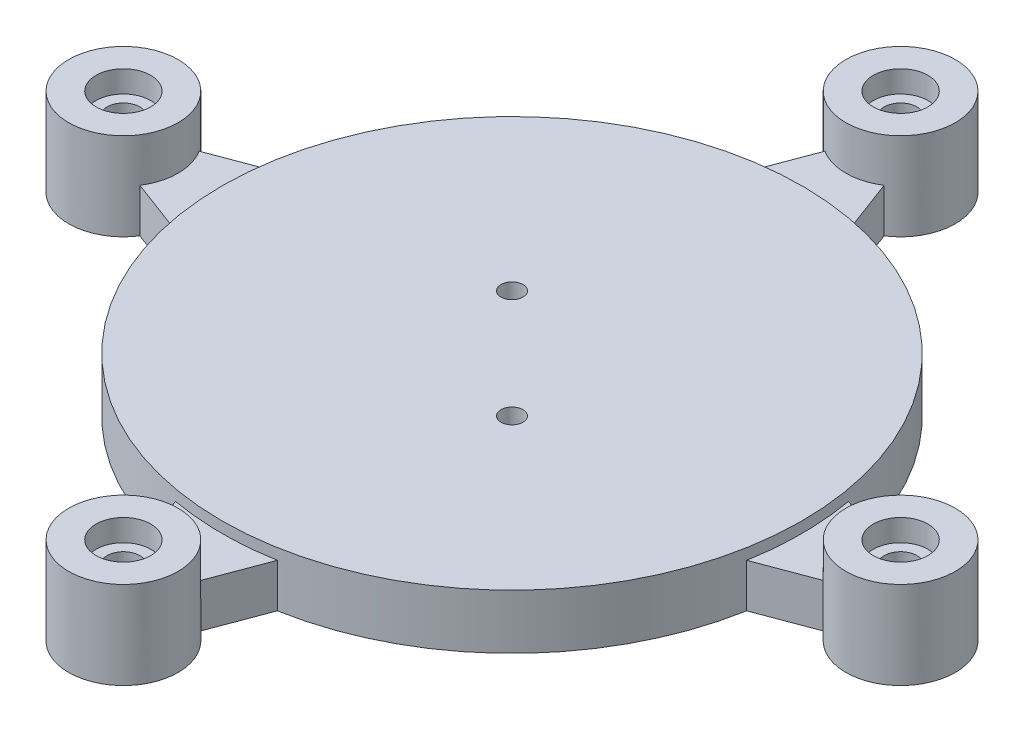
ISO-10303-21;
HEADER;
FILE_DESCRIPTION(('STEP AP214'),'2;1');
FILE_NAME('part.step','',(''),(''),'','','');
FILE_SCHEMA(('AUTOMOTIVE_DESIGN { 1 0 10303 214 1 1 1 1 }'));
ENDSEC;
DATA;
#1=APPLICATION_CONTEXT('core data for automotive mechanical design processes');
#2=APPLICATION_PROTOCOL_DEFINITION('international standard','automotive_design',2000,#1);
#3=PRODUCT_CONTEXT('',#1,'mechanical');
#4=PRODUCT('Part','Part','',(#3));
#5=PRODUCT_RELATED_PRODUCT_CATEGORY('part','',(#4));
#6=PRODUCT_DEFINITION_FORMATION('','',#4);
#7=PRODUCT_DEFINITION_CONTEXT('part definition',#1,'design');
#8=PRODUCT_DEFINITION('design','',#6,#7);
#9=PRODUCT_DEFINITION_SHAPE('','',#8);
#10=(LENGTH_UNIT() NAMED_UNIT(*) SI_UNIT(.MILLI.,.METRE.));
#11=(NAMED_UNIT(*) PLANE_ANGLE_UNIT() SI_UNIT($,.RADIAN.));
#12=(NAMED_UNIT(*) SI_UNIT($,.STERADIAN.) SOLID_ANGLE_UNIT());
#13=UNCERTAINTY_MEASURE_WITH_UNIT(LENGTH_MEASURE(1.E-05),#10,'distance_accuracy_value','');
#14=(GEOMETRIC_REPRESENTATION_CONTEXT(3) GLOBAL_UNCERTAINTY_ASSIGNED_CONTEXT((#13)) GLOBAL_UNIT_ASSIGNED_CONTEXT((#10,
#11,#12)) REPRESENTATION_CONTEXT('',''));
#15=CARTESIAN_POINT('',(0.,0.,0.));
#16=DIRECTION('',(0.,0.,1.));
#17=DIRECTION('',(1.,0.,0.));
#18=AXIS2_PLACEMENT_3D('',#15,#16,#17);
#19=CARTESIAN_POINT('',(35.5,4.,-3.71842762586794E-13));
#20=DIRECTION('',(0.,1.,0.));
#21=DIRECTION('',(-1.,0.,0.));
#22=AXIS2_PLACEMENT_3D('',#19,#20,#21);
#23=PLANE('',#22);
#24=DIRECTION('',(0.936329177569041,0.,-0.351123441588401));
#25=VECTOR('',#24,1.);
#26=CARTESIAN_POINT('',(25.0889608554065,4.,5.02913967922232));
#27=LINE('',#26,#25);
#28=CARTESIAN_POINT('',(26.0880387335617,4.,4.65448547491412));
#29=VERTEX_POINT('',#28);
#30=CARTESIAN_POINT('',(31.2932902974639,4.,2.70251613845072));
#31=VERTEX_POINT('',#30);
#32=EDGE_CURVE('E152',#29,#31,#27,.T.);
#33=ORIENTED_EDGE('',*,*,#32,.T.);
#34=CARTESIAN_POINT('',(35.5,4.,-3.71842762586794E-13));
#35=DIRECTION('',(0.,1.,0.));
#36=DIRECTION('',(-1.,0.,0.));
#37=AXIS2_PLACEMENT_3D('',#34,#35,#36);
#38=CIRCLE('',#37,5.);
#39=CARTESIAN_POINT('',(31.2932902974638,4.,-2.70251613845138));
#40=VERTEX_POINT('',#39);
#41=EDGE_CURVE('E159',#40,#31,#38,.T.);
#42=ORIENTED_EDGE('',*,*,#41,.F.);
#43=DIRECTION('',(-0.936329177569048,0.,-0.351123441588382));
#44=VECTOR('',#43,1.);
#45=CARTESIAN_POINT('',(25.0889608554064,4.,-5.02913967922285));
#46=LINE('',#45,#44);
#47=CARTESIAN_POINT('',(26.0880387335616,4.,-4.65448547491467));
#48=VERTEX_POINT('',#47);
#49=EDGE_CURVE('E143',#40,#48,#46,.T.);
#50=ORIENTED_EDGE('',*,*,#49,.T.);
#51=CARTESIAN_POINT('',(0.,4.,0.));
#52=DIRECTION('',(0.,1.,0.));
#53=DIRECTION('',(0.,0.,1.));
#54=AXIS2_PLACEMENT_3D('',#51,#52,#53);
#55=CIRCLE('',#54,26.5);
#56=EDGE_CURVE('E11',#29,#48,#55,.T.);
#57=ORIENTED_EDGE('',*,*,#56,.F.);
#58=EDGE_LOOP('',(#33,#42,#50,#57));
#59=FACE_BOUND('',#58,.T.);
#60=ADVANCED_FACE('F33',(#59),#23,.T.);
#61=CARTESIAN_POINT('',(0.,4.,35.5));
#62=DIRECTION('',(0.,1.,0.));
#63=DIRECTION('',(0.,0.,-1.));
#64=AXIS2_PLACEMENT_3D('',#61,#62,#63);
#65=PLANE('',#64);
#66=DIRECTION('',(0.351123441588391,0.,0.936329177569045));
#67=VECTOR('',#66,1.);
#68=CARTESIAN_POINT('',(-5.02913967922259,4.,25.0889608554064));
#69=LINE('',#68,#67);
#70=CARTESIAN_POINT('',(-4.6544854749144,4.,26.0880387335616));
#71=VERTEX_POINT('',#70);
#72=CARTESIAN_POINT('',(-2.70251613845105,4.,31.2932902974639));
#73=VERTEX_POINT('',#72);
#74=EDGE_CURVE('E198',#71,#73,#69,.T.);
#75=ORIENTED_EDGE('',*,*,#74,.T.);
#76=CARTESIAN_POINT('',(0.,4.,35.5));
#77=DIRECTION('',(0.,1.,0.));
#78=DIRECTION('',(0.,0.,-1.));
#79=AXIS2_PLACEMENT_3D('',#76,#77,#78);
#80=CIRCLE('',#79,5.);
#81=CARTESIAN_POINT('',(2.70251613845105,4.,31.2932902974639));
#82=VERTEX_POINT('',#81);
#83=EDGE_CURVE('E170',#82,#73,#80,.T.);
#84=ORIENTED_EDGE('',*,*,#83,.F.);
#85=DIRECTION('',(0.351123441588391,0.,-0.936329177569045));
#86=VECTOR('',#85,1.);
#87=CARTESIAN_POINT('',(5.02913967922259,4.,25.0889608554064));
#88=LINE('',#87,#86);
#89=CARTESIAN_POINT('',(4.6544854749144,4.,26.0880387335616));
#90=VERTEX_POINT('',#89);
#91=EDGE_CURVE('E200',#82,#90,#88,.T.);
#92=ORIENTED_EDGE('',*,*,#91,.T.);
#93=CARTESIAN_POINT('',(0.,4.,0.));
#94=DIRECTION('',(0.,1.,0.));
#95=DIRECTION('',(0.,0.,1.));
#96=AXIS2_PLACEMENT_3D('',#93,#94,#95);
#97=CIRCLE('',#96,26.5);
#98=EDGE_CURVE('E41',#71,#90,#97,.T.);
#99=ORIENTED_EDGE('',*,*,#98,.F.);
#100=EDGE_LOOP('',(#75,#84,#92,#99));
#101=FACE_BOUND('',#100,.T.);
#102=ADVANCED_FACE('F306',(#101),#65,.T.);
#103=CARTESIAN_POINT('',(-35.5,4.,1.23947587528931E-13));
#104=DIRECTION('',(0.,1.,0.));
#105=DIRECTION('',(1.,0.,0.));
#106=AXIS2_PLACEMENT_3D('',#103,#104,#105);
#107=PLANE('',#106);
#108=DIRECTION('',(-0.936329177569043,0.,0.351123441588395));
#109=VECTOR('',#108,1.);
#110=CARTESIAN_POINT('',(-25.0889608554065,4.,-5.0291396792225));
#111=LINE('',#110,#109);
#112=CARTESIAN_POINT('',(-26.0880387335616,4.,-4.65448547491431));
#113=VERTEX_POINT('',#112);
#114=CARTESIAN_POINT('',(-31.2932902974639,4.,-2.70251613845094));
#115=VERTEX_POINT('',#114);
#116=EDGE_CURVE('E222',#113,#115,#111,.T.);
#117=ORIENTED_EDGE('',*,*,#116,.T.);
#118=CARTESIAN_POINT('',(-35.5,4.,1.23947587528931E-13));
#119=DIRECTION('',(0.,1.,0.));
#120=DIRECTION('',(1.,0.,0.));
#121=AXIS2_PLACEMENT_3D('',#118,#119,#120);
#122=CIRCLE('',#121,5.);
#123=CARTESIAN_POINT('',(-31.2932902974639,4.,2.70251613845116));
#124=VERTEX_POINT('',#123);
#125=EDGE_CURVE('E180',#124,#115,#122,.T.);
#126=ORIENTED_EDGE('',*,*,#125,.F.);
#127=DIRECTION('',(0.936329177569046,0.,0.351123441588388));
#128=VECTOR('',#127,1.);
#129=CARTESIAN_POINT('',(-25.0889608554064,4.,5.02913967922268));
#130=LINE('',#129,#128);
#131=CARTESIAN_POINT('',(-26.0880387335616,4.,4.65448547491449));
#132=VERTEX_POINT('',#131);
#133=EDGE_CURVE('E224',#124,#132,#130,.T.);
#134=ORIENTED_EDGE('',*,*,#133,.T.);
#135=CARTESIAN_POINT('',(0.,4.,0.));
#136=DIRECTION('',(0.,1.,0.));
#137=DIRECTION('',(0.,0.,1.));
#138=AXIS2_PLACEMENT_3D('',#135,#136,#137);
#139=CIRCLE('',#138,26.5);
#140=EDGE_CURVE('E296',#113,#132,#139,.T.);
#141=ORIENTED_EDGE('',*,*,#140,.F.);
#142=EDGE_LOOP('',(#117,#126,#134,#141));
#143=FACE_BOUND('',#142,.T.);
#144=ADVANCED_FACE('F353',(#143),#107,.T.);
#145=CARTESIAN_POINT('',(0.,5.,0.));
#146=DIRECTION('',(0.,-1.,0.));
#147=DIRECTION('',(0.,0.,-1.));
#148=AXIS2_PLACEMENT_3D('',#145,#146,#147);
#149=CYLINDRICAL_SURFACE('',#148,26.5);
#150=CARTESIAN_POINT('',(0.,5.,0.));
#151=DIRECTION('',(0.,1.,0.));
#152=DIRECTION('',(0.,0.,1.));
#153=AXIS2_PLACEMENT_3D('',#150,#151,#152);
#154=CIRCLE('',#153,26.5);
#155=CARTESIAN_POINT('',(0.,5.,26.5));
#156=VERTEX_POINT('',#155);
#157=EDGE_CURVE('E288',#156,#156,#154,.T.);
#158=ORIENTED_EDGE('',*,*,#157,.F.);
#159=EDGE_LOOP('',(#158));
#160=FACE_BOUND('',#159,.T.);
#161=DIRECTION('',(0.,-1.,0.));
#162=VECTOR('',#161,1.);
#163=CARTESIAN_POINT('',(26.0880387335617,5.,4.65448547491412));
#164=LINE('',#163,#162);
#165=CARTESIAN_POINT('',(26.0880387335617,0.,4.65448547491413));
#166=VERTEX_POINT('',#165);
#167=EDGE_CURVE('E51',#29,#166,#164,.T.);
#168=ORIENTED_EDGE('',*,*,#167,.F.);
#169=ORIENTED_EDGE('',*,*,#56,.T.);
#170=DIRECTION('',(0.,-1.,0.));
#171=VECTOR('',#170,1.);
#172=CARTESIAN_POINT('',(26.0880387335616,5.,-4.65448547491467));
#173=LINE('',#172,#171);
#174=CARTESIAN_POINT('',(26.0880387335616,0.,-4.65448547491467));
#175=VERTEX_POINT('',#174);
#176=EDGE_CURVE('E149',#175,#48,#173,.F.);
#177=ORIENTED_EDGE('',*,*,#176,.F.);
#178=CARTESIAN_POINT('',(0.,0.,0.));
#179=DIRECTION('',(0.,1.,0.));
#180=DIRECTION('',(0.,0.,1.));
#181=AXIS2_PLACEMENT_3D('',#178,#179,#180);
#182=CIRCLE('',#181,26.5);
#183=CARTESIAN_POINT('',(4.65448547491439,0.,-26.0880387335616));
#184=VERTEX_POINT('',#183);
#185=EDGE_CURVE('E287',#175,#184,#182,.T.);
#186=ORIENTED_EDGE('',*,*,#185,.T.);
#187=DIRECTION('',(0.,-1.,0.));
#188=VECTOR('',#187,1.);
#189=CARTESIAN_POINT('',(4.6544854749144,5.,-26.0880387335616));
#190=LINE('',#189,#188);
#191=CARTESIAN_POINT('',(4.6544854749144,4.,-26.0880387335616));
#192=VERTEX_POINT('',#191);
#193=EDGE_CURVE('E284',#192,#184,#190,.T.);
#194=ORIENTED_EDGE('',*,*,#193,.F.);
#195=CARTESIAN_POINT('',(0.,4.,0.));
#196=DIRECTION('',(0.,1.,0.));
#197=DIRECTION('',(0.,0.,1.));
#198=AXIS2_PLACEMENT_3D('',#195,#196,#197);
#199=CIRCLE('',#198,26.5);
#200=CARTESIAN_POINT('',(-4.6544854749144,4.,-26.0880387335616));
#201=VERTEX_POINT('',#200);
#202=EDGE_CURVE('E291',#192,#201,#199,.T.);
#203=ORIENTED_EDGE('',*,*,#202,.T.);
#204=DIRECTION('',(0.,-1.,0.));
#205=VECTOR('',#204,1.);
#206=CARTESIAN_POINT('',(-4.6544854749144,5.,-26.0880387335616));
#207=LINE('',#206,#205);
#208=CARTESIAN_POINT('',(-4.6544854749144,0.,-26.0880387335616));
#209=VERTEX_POINT('',#208);
#210=EDGE_CURVE('E281',#209,#201,#207,.F.);
#211=ORIENTED_EDGE('',*,*,#210,.F.);
#212=CARTESIAN_POINT('',(-26.0880387335616,0.,-4.65448547491431));
#213=VERTEX_POINT('',#212);
#214=EDGE_CURVE('E292',#209,#213,#182,.T.);
#215=ORIENTED_EDGE('',*,*,#214,.T.);
#216=DIRECTION('',(0.,-1.,0.));
#217=VECTOR('',#216,1.);
#218=CARTESIAN_POINT('',(-26.0880387335616,5.,-4.65448547491431));
#219=LINE('',#218,#217);
#220=EDGE_CURVE('E242',#113,#213,#219,.T.);
#221=ORIENTED_EDGE('',*,*,#220,.F.);
#222=ORIENTED_EDGE('',*,*,#140,.T.);
#223=DIRECTION('',(0.,-1.,0.));
#224=VECTOR('',#223,1.);
#225=CARTESIAN_POINT('',(-26.0880387335616,5.,4.65448547491449));
#226=LINE('',#225,#224);
#227=CARTESIAN_POINT('',(-26.0880387335616,0.,4.65448547491449));
#228=VERTEX_POINT('',#227);
#229=EDGE_CURVE('E239',#228,#132,#226,.F.);
#230=ORIENTED_EDGE('',*,*,#229,.F.);
#231=CARTESIAN_POINT('',(-4.65448547491439,0.,26.0880387335616));
#232=VERTEX_POINT('',#231);
#233=EDGE_CURVE('E294',#228,#232,#182,.T.);
#234=ORIENTED_EDGE('',*,*,#233,.T.);
#235=DIRECTION('',(0.,-1.,0.));
#236=VECTOR('',#235,1.);
#237=CARTESIAN_POINT('',(-4.6544854749144,5.,26.0880387335616));
#238=LINE('',#237,#236);
#239=EDGE_CURVE('E218',#71,#232,#238,.T.);
#240=ORIENTED_EDGE('',*,*,#239,.F.);
#241=ORIENTED_EDGE('',*,*,#98,.T.);
#242=DIRECTION('',(0.,-1.,0.));
#243=VECTOR('',#242,1.);
#244=CARTESIAN_POINT('',(4.6544854749144,5.,26.0880387335616));
#245=LINE('',#244,#243);
#246=CARTESIAN_POINT('',(4.6544854749144,0.,26.0880387335616));
#247=VERTEX_POINT('',#246);
#248=EDGE_CURVE('E215',#247,#90,#245,.F.);
#249=ORIENTED_EDGE('',*,*,#248,.F.);
#250=EDGE_CURVE('E317',#247,#166,#182,.T.);
#251=ORIENTED_EDGE('',*,*,#250,.T.);
#252=EDGE_LOOP('',(#168,#169,#177,#186,#194,#203,#211,#215,#221,#222,#230,#234,#240,#241,#249,#251));
#253=FACE_BOUND('',#252,.T.);
#254=ADVANCED_FACE('F35',(#160,#253),#149,.T.);
#255=CARTESIAN_POINT('',(0.,4.,-35.5));
#256=DIRECTION('',(0.,1.,0.));
#257=DIRECTION('',(0.,0.,1.));
#258=AXIS2_PLACEMENT_3D('',#255,#256,#257);
#259=PLANE('',#258);
#260=DIRECTION('',(-0.351123441588391,0.,-0.936329177569045));
#261=VECTOR('',#260,1.);
#262=CARTESIAN_POINT('',(5.02913967922259,4.,-25.0889608554064));
#263=LINE('',#262,#261);
#264=CARTESIAN_POINT('',(2.70251613845105,4.,-31.2932902974639));
#265=VERTEX_POINT('',#264);
#266=EDGE_CURVE('E264',#192,#265,#263,.T.);
#267=ORIENTED_EDGE('',*,*,#266,.T.);
#268=CARTESIAN_POINT('',(0.,4.,-35.5));
#269=DIRECTION('',(0.,1.,0.));
#270=DIRECTION('',(0.,0.,1.));
#271=AXIS2_PLACEMENT_3D('',#268,#269,#270);
#272=CIRCLE('',#271,5.);
#273=CARTESIAN_POINT('',(-2.70251613845105,4.,-31.2932902974639));
#274=VERTEX_POINT('',#273);
#275=EDGE_CURVE('E255',#274,#265,#272,.T.);
#276=ORIENTED_EDGE('',*,*,#275,.F.);
#277=DIRECTION('',(-0.351123441588391,0.,0.936329177569045));
#278=VECTOR('',#277,1.);
#279=CARTESIAN_POINT('',(-5.02913967922259,4.,-25.0889608554064));
#280=LINE('',#279,#278);
#281=EDGE_CURVE('E266',#274,#201,#280,.T.);
#282=ORIENTED_EDGE('',*,*,#281,.T.);
#283=ORIENTED_EDGE('',*,*,#202,.F.);
#284=EDGE_LOOP('',(#267,#276,#282,#283));
#285=FACE_BOUND('',#284,.T.);
#286=ADVANCED_FACE('F335',(#285),#259,.T.);
#287=CARTESIAN_POINT('',(0.,5.,0.));
#288=DIRECTION('',(0.,1.,0.));
#289=DIRECTION('',(0.,0.,1.));
#290=AXIS2_PLACEMENT_3D('',#287,#288,#289);
#291=PLANE('',#290);
#292=CARTESIAN_POINT('',(4.94974746830583,5.,4.94974746830584));
#293=DIRECTION('',(0.,1.,0.));
#294=DIRECTION('',(0.,0.,1.));
#295=AXIS2_PLACEMENT_3D('',#292,#293,#294);
#296=CIRCLE('',#295,1.);
#297=CARTESIAN_POINT('',(4.94974746830583,5.,5.94974746830584));
#298=VERTEX_POINT('',#297);
#299=EDGE_CURVE('E700',#298,#298,#296,.T.);
#300=ORIENTED_EDGE('',*,*,#299,.F.);
#301=EDGE_LOOP('',(#300));
#302=FACE_BOUND('',#301,.T.);
#303=CARTESIAN_POINT('',(-4.94974746830583,5.,-4.94974746830584));
#304=DIRECTION('',(0.,1.,0.));
#305=DIRECTION('',(0.,0.,1.));
#306=AXIS2_PLACEMENT_3D('',#303,#304,#305);
#307=CIRCLE('',#306,1.);
#308=CARTESIAN_POINT('',(-4.94974746830583,5.,-3.94974746830584));
#309=VERTEX_POINT('',#308);
#310=EDGE_CURVE('E696',#309,#309,#307,.T.);
#311=ORIENTED_EDGE('',*,*,#310,.F.);
#312=EDGE_LOOP('',(#311));
#313=FACE_BOUND('',#312,.T.);
#314=ORIENTED_EDGE('',*,*,#157,.T.);
#315=EDGE_LOOP('',(#314));
#316=FACE_BOUND('',#315,.T.);
#317=ADVANCED_FACE('F624',(#302,#313,#316),#291,.T.);
#318=CARTESIAN_POINT('',(0.,0.,0.));
#319=DIRECTION('',(0.,1.,0.));
#320=DIRECTION('',(0.,0.,1.));
#321=AXIS2_PLACEMENT_3D('',#318,#319,#320);
#322=PLANE('',#321);
#323=CARTESIAN_POINT('',(4.94974746830583,0.,4.94974746830584));
#324=DIRECTION('',(0.,1.,0.));
#325=DIRECTION('',(0.,0.,1.));
#326=AXIS2_PLACEMENT_3D('',#323,#324,#325);
#327=CIRCLE('',#326,1.);
#328=CARTESIAN_POINT('',(4.94974746830583,0.,5.94974746830584));
#329=VERTEX_POINT('',#328);
#330=EDGE_CURVE('E638',#329,#329,#327,.T.);
#331=ORIENTED_EDGE('',*,*,#330,.T.);
#332=EDGE_LOOP('',(#331));
#333=FACE_BOUND('',#332,.T.);
#334=CARTESIAN_POINT('',(-4.94974746830583,0.,-4.94974746830584));
#335=DIRECTION('',(0.,1.,0.));
#336=DIRECTION('',(0.,0.,1.));
#337=AXIS2_PLACEMENT_3D('',#334,#335,#336);
#338=CIRCLE('',#337,1.);
#339=CARTESIAN_POINT('',(-4.94974746830583,0.,-3.94974746830584));
#340=VERTEX_POINT('',#339);
#341=EDGE_CURVE('E642',#340,#340,#338,.T.);
#342=ORIENTED_EDGE('',*,*,#341,.T.);
#343=EDGE_LOOP('',(#342));
#344=FACE_BOUND('',#343,.T.);
#345=CARTESIAN_POINT('',(35.5,0.,-3.71842762586794E-13));
#346=DIRECTION('',(0.,1.,0.));
#347=DIRECTION('',(-1.,0.,0.));
#348=AXIS2_PLACEMENT_3D('',#345,#346,#347);
#349=CIRCLE('',#348,1.5);
#350=CARTESIAN_POINT('',(34.,0.,-3.56131096562E-13));
#351=VERTEX_POINT('',#350);
#352=EDGE_CURVE('E646',#351,#351,#349,.T.);
#353=ORIENTED_EDGE('',*,*,#352,.T.);
#354=EDGE_LOOP('',(#353));
#355=FACE_BOUND('',#354,.T.);
#356=CARTESIAN_POINT('',(0.,0.,35.5));
#357=DIRECTION('',(0.,1.,0.));
#358=DIRECTION('',(0.,0.,-1.));
#359=AXIS2_PLACEMENT_3D('',#356,#357,#358);
#360=CIRCLE('',#359,1.5);
#361=CARTESIAN_POINT('',(0.,0.,34.));
#362=VERTEX_POINT('',#361);
#363=EDGE_CURVE('E650',#362,#362,#360,.T.);
#364=ORIENTED_EDGE('',*,*,#363,.T.);
#365=EDGE_LOOP('',(#364));
#366=FACE_BOUND('',#365,.T.);
#367=CARTESIAN_POINT('',(-35.5,0.,1.23947587528931E-13));
#368=DIRECTION('',(0.,1.,0.));
#369=DIRECTION('',(1.,0.,0.));
#370=AXIS2_PLACEMENT_3D('',#367,#368,#369);
#371=CIRCLE('',#370,1.5);
#372=CARTESIAN_POINT('',(-34.,0.,1.18710365520667E-13));
#373=VERTEX_POINT('',#372);
#374=EDGE_CURVE('E653',#373,#373,#371,.T.);
#375=ORIENTED_EDGE('',*,*,#374,.T.);
#376=EDGE_LOOP('',(#375));
#377=FACE_BOUND('',#376,.T.);
#378=ORIENTED_EDGE('',*,*,#185,.F.);
#379=DIRECTION('',(-0.936329177569048,0.,-0.351123441588382));
#380=VECTOR('',#379,1.);
#381=CARTESIAN_POINT('',(25.0889608554064,0.,-5.02913967922285));
#382=LINE('',#381,#380);
#383=CARTESIAN_POINT('',(31.2932902974638,0.,-2.70251613845138));
#384=VERTEX_POINT('',#383);
#385=EDGE_CURVE('E189',#384,#175,#382,.T.);
#386=ORIENTED_EDGE('',*,*,#385,.F.);
#387=CARTESIAN_POINT('',(35.5,0.,-3.71842762586794E-13));
#388=DIRECTION('',(0.,1.,0.));
#389=DIRECTION('',(-1.,0.,0.));
#390=AXIS2_PLACEMENT_3D('',#387,#388,#389);
#391=CIRCLE('',#390,5.);
#392=CARTESIAN_POINT('',(31.2932902974639,0.,2.70251613845072));
#393=VERTEX_POINT('',#392);
#394=EDGE_CURVE('E161',#393,#384,#391,.T.);
#395=ORIENTED_EDGE('',*,*,#394,.F.);
#396=DIRECTION('',(0.936329177569041,0.,-0.351123441588401));
#397=VECTOR('',#396,1.);
#398=CARTESIAN_POINT('',(25.0889608554065,0.,5.02913967922232));
#399=LINE('',#398,#397);
#400=EDGE_CURVE('E186',#166,#393,#399,.T.);
#401=ORIENTED_EDGE('',*,*,#400,.F.);
#402=ORIENTED_EDGE('',*,*,#250,.F.);
#403=DIRECTION('',(0.351123441588391,0.,-0.936329177569045));
#404=VECTOR('',#403,1.);
#405=CARTESIAN_POINT('',(5.02913967922259,0.,25.0889608554064));
#406=LINE('',#405,#404);
#407=CARTESIAN_POINT('',(2.70251613845105,0.,31.2932902974639));
#408=VERTEX_POINT('',#407);
#409=EDGE_CURVE('E201',#408,#247,#406,.T.);
#410=ORIENTED_EDGE('',*,*,#409,.F.);
#411=CARTESIAN_POINT('',(0.,0.,35.5));
#412=DIRECTION('',(0.,1.,0.));
#413=DIRECTION('',(0.,0.,-1.));
#414=AXIS2_PLACEMENT_3D('',#411,#412,#413);
#415=CIRCLE('',#414,5.);
#416=CARTESIAN_POINT('',(-2.70251613845105,0.,31.2932902974639));
#417=VERTEX_POINT('',#416);
#418=EDGE_CURVE('E206',#417,#408,#415,.T.);
#419=ORIENTED_EDGE('',*,*,#418,.F.);
#420=DIRECTION('',(0.351123441588391,0.,0.936329177569045));
#421=VECTOR('',#420,1.);
#422=CARTESIAN_POINT('',(-5.02913967922259,0.,25.0889608554064));
#423=LINE('',#422,#421);
#424=EDGE_CURVE('E197',#232,#417,#423,.T.);
#425=ORIENTED_EDGE('',*,*,#424,.F.);
#426=ORIENTED_EDGE('',*,*,#233,.F.);
#427=DIRECTION('',(0.936329177569046,0.,0.351123441588388));
#428=VECTOR('',#427,1.);
#429=CARTESIAN_POINT('',(-25.0889608554064,0.,5.02913967922268));
#430=LINE('',#429,#428);
#431=CARTESIAN_POINT('',(-31.2932902974639,0.,2.70251613845116));
#432=VERTEX_POINT('',#431);
#433=EDGE_CURVE('E225',#432,#228,#430,.T.);
#434=ORIENTED_EDGE('',*,*,#433,.F.);
#435=CARTESIAN_POINT('',(-35.5,0.,1.23947587528931E-13));
#436=DIRECTION('',(0.,1.,0.));
#437=DIRECTION('',(1.,0.,0.));
#438=AXIS2_PLACEMENT_3D('',#435,#436,#437);
#439=CIRCLE('',#438,5.);
#440=CARTESIAN_POINT('',(-31.2932902974639,0.,-2.70251613845094));
#441=VERTEX_POINT('',#440);
#442=EDGE_CURVE('E230',#441,#432,#439,.T.);
#443=ORIENTED_EDGE('',*,*,#442,.F.);
#444=DIRECTION('',(-0.936329177569043,0.,0.351123441588395));
#445=VECTOR('',#444,1.);
#446=CARTESIAN_POINT('',(-25.0889608554065,0.,-5.0291396792225));
#447=LINE('',#446,#445);
#448=EDGE_CURVE('E221',#213,#441,#447,.T.);
#449=ORIENTED_EDGE('',*,*,#448,.F.);
#450=ORIENTED_EDGE('',*,*,#214,.F.);
#451=DIRECTION('',(-0.351123441588391,0.,0.936329177569045));
#452=VECTOR('',#451,1.);
#453=CARTESIAN_POINT('',(-5.02913967922259,0.,-25.0889608554064));
#454=LINE('',#453,#452);
#455=CARTESIAN_POINT('',(-2.70251613845105,0.,-31.2932902974639));
#456=VERTEX_POINT('',#455);
#457=EDGE_CURVE('E267',#456,#209,#454,.T.);
#458=ORIENTED_EDGE('',*,*,#457,.F.);
#459=CARTESIAN_POINT('',(0.,0.,-35.5));
#460=DIRECTION('',(0.,1.,0.));
#461=DIRECTION('',(0.,0.,1.));
#462=AXIS2_PLACEMENT_3D('',#459,#460,#461);
#463=CIRCLE('',#462,5.);
#464=CARTESIAN_POINT('',(2.70251613845105,0.,-31.2932902974639));
#465=VERTEX_POINT('',#464);
#466=EDGE_CURVE('E272',#465,#456,#463,.T.);
#467=ORIENTED_EDGE('',*,*,#466,.F.);
#468=DIRECTION('',(-0.351123441588391,0.,-0.936329177569045));
#469=VECTOR('',#468,1.);
#470=CARTESIAN_POINT('',(5.02913967922259,0.,-25.0889608554064));
#471=LINE('',#470,#469);
#472=EDGE_CURVE('E261',#184,#465,#471,.T.);
#473=ORIENTED_EDGE('',*,*,#472,.F.);
#474=EDGE_LOOP('',(#378,#386,#395,#401,#402,#410,#419,#425,#426,#434,#443,#449,#450,#458,#467,#473));
#475=FACE_BOUND('',#474,.T.);
#476=CARTESIAN_POINT('',(0.,0.,-35.5));
#477=DIRECTION('',(0.,1.,0.));
#478=DIRECTION('',(0.,0.,1.));
#479=AXIS2_PLACEMENT_3D('',#476,#477,#478);
#480=CIRCLE('',#479,1.5);
#481=CARTESIAN_POINT('',(0.,0.,-34.));
#482=VERTEX_POINT('',#481);
#483=EDGE_CURVE('E246',#482,#482,#480,.T.);
#484=ORIENTED_EDGE('',*,*,#483,.T.);
#485=EDGE_LOOP('',(#484));
#486=FACE_BOUND('',#485,.T.);
#487=ADVANCED_FACE('F313',(#333,#344,#355,#366,#377,#475,#486),#322,.F.);
#488=CARTESIAN_POINT('',(5.02913967922259,4.,-25.0889608554064));
#489=DIRECTION('',(-0.936329177569045,0.,0.351123441588391));
#490=DIRECTION('',(0.351123441588391,0.,0.936329177569045));
#491=AXIS2_PLACEMENT_3D('',#488,#489,#490);
#492=PLANE('',#491);
#493=ORIENTED_EDGE('',*,*,#266,.F.);
#494=ORIENTED_EDGE('',*,*,#193,.T.);
#495=ORIENTED_EDGE('',*,*,#472,.T.);
#496=DIRECTION('',(0.,-1.,0.));
#497=VECTOR('',#496,1.);
#498=CARTESIAN_POINT('',(2.70251613845105,4.,-31.2932902974639));
#499=LINE('',#498,#497);
#500=EDGE_CURVE('E278',#265,#465,#499,.T.);
#501=ORIENTED_EDGE('',*,*,#500,.F.);
#502=EDGE_LOOP('',(#493,#494,#495,#501));
#503=FACE_BOUND('',#502,.T.);
#504=ADVANCED_FACE('F322',(#503),#492,.F.);
#505=CARTESIAN_POINT('',(-5.02913967922259,4.,-25.0889608554064));
#506=DIRECTION('',(0.936329177569045,0.,0.351123441588391));
#507=DIRECTION('',(0.351123441588391,0.,-0.936329177569045));
#508=AXIS2_PLACEMENT_3D('',#505,#506,#507);
#509=PLANE('',#508);
#510=ORIENTED_EDGE('',*,*,#457,.T.);
#511=ORIENTED_EDGE('',*,*,#210,.T.);
#512=ORIENTED_EDGE('',*,*,#281,.F.);
#513=DIRECTION('',(0.,-1.,0.));
#514=VECTOR('',#513,1.);
#515=CARTESIAN_POINT('',(-2.70251613845105,4.,-31.2932902974639));
#516=LINE('',#515,#514);
#517=EDGE_CURVE('E270',#274,#456,#516,.T.);
#518=ORIENTED_EDGE('',*,*,#517,.T.);
#519=EDGE_LOOP('',(#510,#511,#512,#518));
#520=FACE_BOUND('',#519,.T.);
#521=ADVANCED_FACE('F332',(#520),#509,.F.);
#522=CARTESIAN_POINT('',(0.,4.,-35.5));
#523=DIRECTION('',(0.,-1.,0.));
#524=DIRECTION('',(0.,0.,-1.));
#525=AXIS2_PLACEMENT_3D('',#522,#523,#524);
#526=CYLINDRICAL_SURFACE('',#525,5.);
#527=ORIENTED_EDGE('',*,*,#466,.T.);
#528=ORIENTED_EDGE('',*,*,#517,.F.);
#529=ORIENTED_EDGE('',*,*,#275,.T.);
#530=ORIENTED_EDGE('',*,*,#500,.T.);
#531=EDGE_LOOP('',(#527,#528,#529,#530));
#532=FACE_BOUND('',#531,.T.);
#533=CARTESIAN_POINT('',(0.,8.,-35.5));
#534=DIRECTION('',(0.,1.,0.));
#535=DIRECTION('',(0.,0.,1.));
#536=AXIS2_PLACEMENT_3D('',#533,#534,#535);
#537=CIRCLE('',#536,5.);
#538=CARTESIAN_POINT('',(0.,8.,-30.5));
#539=VERTEX_POINT('',#538);
#540=EDGE_CURVE('E258',#539,#539,#537,.T.);
#541=ORIENTED_EDGE('',*,*,#540,.F.);
#542=EDGE_LOOP('',(#541));
#543=FACE_BOUND('',#542,.T.);
#544=ADVANCED_FACE('F328',(#532,#543),#526,.T.);
#545=CARTESIAN_POINT('',(0.,8.,-35.5));
#546=DIRECTION('',(0.,1.,0.));
#547=DIRECTION('',(0.,0.,1.));
#548=AXIS2_PLACEMENT_3D('',#545,#546,#547);
#549=PLANE('',#548);
#550=CARTESIAN_POINT('',(0.,8.,-35.5));
#551=DIRECTION('',(0.,1.,0.));
#552=DIRECTION('',(0.,0.,1.));
#553=AXIS2_PLACEMENT_3D('',#550,#551,#552);
#554=CIRCLE('',#553,2.5);
#555=CARTESIAN_POINT('',(0.,8.,-33.));
#556=VERTEX_POINT('',#555);
#557=EDGE_CURVE('E249',#556,#556,#554,.T.);
#558=ORIENTED_EDGE('',*,*,#557,.F.);
#559=EDGE_LOOP('',(#558));
#560=FACE_BOUND('',#559,.T.);
#561=ORIENTED_EDGE('',*,*,#540,.T.);
#562=EDGE_LOOP('',(#561));
#563=FACE_BOUND('',#562,.T.);
#564=ADVANCED_FACE('F618',(#560,#563),#549,.T.);
#565=CARTESIAN_POINT('',(0.,6.,-35.5));
#566=DIRECTION('',(0.,1.,0.));
#567=DIRECTION('',(0.,0.,1.));
#568=AXIS2_PLACEMENT_3D('',#565,#566,#567);
#569=CYLINDRICAL_SURFACE('',#568,2.5);
#570=CARTESIAN_POINT('',(0.,6.,-35.5));
#571=DIRECTION('',(0.,1.,0.));
#572=DIRECTION('',(0.,0.,1.));
#573=AXIS2_PLACEMENT_3D('',#570,#571,#572);
#574=CIRCLE('',#573,2.5);
#575=CARTESIAN_POINT('',(0.,6.,-33.));
#576=VERTEX_POINT('',#575);
#577=EDGE_CURVE('E252',#576,#576,#574,.T.);
#578=ORIENTED_EDGE('',*,*,#577,.F.);
#579=EDGE_LOOP('',(#578));
#580=FACE_BOUND('',#579,.T.);
#581=ORIENTED_EDGE('',*,*,#557,.T.);
#582=EDGE_LOOP('',(#581));
#583=FACE_BOUND('',#582,.T.);
#584=ADVANCED_FACE('F614',(#580,#583),#569,.F.);
#585=CARTESIAN_POINT('',(0.,6.,-35.5));
#586=DIRECTION('',(0.,1.,0.));
#587=DIRECTION('',(0.,0.,1.));
#588=AXIS2_PLACEMENT_3D('',#585,#586,#587);
#589=PLANE('',#588);
#590=CARTESIAN_POINT('',(0.,6.,-35.5));
#591=DIRECTION('',(0.,1.,0.));
#592=DIRECTION('',(0.,0.,1.));
#593=AXIS2_PLACEMENT_3D('',#590,#591,#592);
#594=CIRCLE('',#593,1.5);
#595=CARTESIAN_POINT('',(0.,6.,-34.));
#596=VERTEX_POINT('',#595);
#597=EDGE_CURVE('E245',#596,#596,#594,.T.);
#598=ORIENTED_EDGE('',*,*,#597,.F.);
#599=EDGE_LOOP('',(#598));
#600=FACE_BOUND('',#599,.T.);
#601=ORIENTED_EDGE('',*,*,#577,.T.);
#602=EDGE_LOOP('',(#601));
#603=FACE_BOUND('',#602,.T.);
#604=ADVANCED_FACE('F610',(#600,#603),#589,.T.);
#605=CARTESIAN_POINT('',(0.,0.,-35.5));
#606=DIRECTION('',(0.,1.,0.));
#607=DIRECTION('',(0.,0.,1.));
#608=AXIS2_PLACEMENT_3D('',#605,#606,#607);
#609=CYLINDRICAL_SURFACE('',#608,1.5);
#610=ORIENTED_EDGE('',*,*,#483,.F.);
#611=EDGE_LOOP('',(#610));
#612=FACE_BOUND('',#611,.T.);
#613=ORIENTED_EDGE('',*,*,#597,.T.);
#614=EDGE_LOOP('',(#613));
#615=FACE_BOUND('',#614,.T.);
#616=ADVANCED_FACE('F595',(#612,#615),#609,.F.);
#617=CARTESIAN_POINT('',(-25.0889608554065,4.,-5.0291396792225));
#618=DIRECTION('',(0.351123441588395,0.,0.936329177569043));
#619=DIRECTION('',(0.936329177569043,0.,-0.351123441588395));
#620=AXIS2_PLACEMENT_3D('',#617,#618,#619);
#621=PLANE('',#620);
#622=ORIENTED_EDGE('',*,*,#116,.F.);
#623=ORIENTED_EDGE('',*,*,#220,.T.);
#624=ORIENTED_EDGE('',*,*,#448,.T.);
#625=DIRECTION('',(0.,-1.,0.));
#626=VECTOR('',#625,1.);
#627=CARTESIAN_POINT('',(-31.2932902974639,4.,-2.70251613845094));
#628=LINE('',#627,#626);
#629=EDGE_CURVE('E236',#115,#441,#628,.T.);
#630=ORIENTED_EDGE('',*,*,#629,.F.);
#631=EDGE_LOOP('',(#622,#623,#624,#630));
#632=FACE_BOUND('',#631,.T.);
#633=ADVANCED_FACE('F340',(#632),#621,.F.);
#634=CARTESIAN_POINT('',(-25.0889608554064,4.,5.02913967922268));
#635=DIRECTION('',(0.351123441588388,0.,-0.936329177569046));
#636=DIRECTION('',(-0.936329177569046,0.,-0.351123441588388));
#637=AXIS2_PLACEMENT_3D('',#634,#635,#636);
#638=PLANE('',#637);
#639=ORIENTED_EDGE('',*,*,#433,.T.);
#640=ORIENTED_EDGE('',*,*,#229,.T.);
#641=ORIENTED_EDGE('',*,*,#133,.F.);
#642=DIRECTION('',(0.,-1.,0.));
#643=VECTOR('',#642,1.);
#644=CARTESIAN_POINT('',(-31.2932902974639,4.,2.70251613845116));
#645=LINE('',#644,#643);
#646=EDGE_CURVE('E228',#124,#432,#645,.T.);
#647=ORIENTED_EDGE('',*,*,#646,.T.);
#648=EDGE_LOOP('',(#639,#640,#641,#647));
#649=FACE_BOUND('',#648,.T.);
#650=ADVANCED_FACE('F350',(#649),#638,.F.);
#651=CARTESIAN_POINT('',(-35.5,4.,1.23947587528931E-13));
#652=DIRECTION('',(0.,-1.,0.));
#653=DIRECTION('',(0.,0.,-1.));
#654=AXIS2_PLACEMENT_3D('',#651,#652,#653);
#655=CYLINDRICAL_SURFACE('',#654,5.);
#656=ORIENTED_EDGE('',*,*,#442,.T.);
#657=ORIENTED_EDGE('',*,*,#646,.F.);
#658=ORIENTED_EDGE('',*,*,#125,.T.);
#659=ORIENTED_EDGE('',*,*,#629,.T.);
#660=EDGE_LOOP('',(#656,#657,#658,#659));
#661=FACE_BOUND('',#660,.T.);
#662=CARTESIAN_POINT('',(-35.5,8.,1.23947587528931E-13));
#663=DIRECTION('',(0.,1.,0.));
#664=DIRECTION('',(1.,0.,0.));
#665=AXIS2_PLACEMENT_3D('',#662,#663,#664);
#666=CIRCLE('',#665,5.);
#667=CARTESIAN_POINT('',(-30.5,8.,1.06490180834716E-13));
#668=VERTEX_POINT('',#667);
#669=EDGE_CURVE('E183',#668,#668,#666,.T.);
#670=ORIENTED_EDGE('',*,*,#669,.F.);
#671=EDGE_LOOP('',(#670));
#672=FACE_BOUND('',#671,.T.);
#673=ADVANCED_FACE('F346',(#661,#672),#655,.T.);
#674=CARTESIAN_POINT('',(-5.02913967922259,4.,25.0889608554064));
#675=DIRECTION('',(0.936329177569045,0.,-0.351123441588391));
#676=DIRECTION('',(-0.351123441588391,0.,-0.936329177569045));
#677=AXIS2_PLACEMENT_3D('',#674,#675,#676);
#678=PLANE('',#677);
#679=ORIENTED_EDGE('',*,*,#74,.F.);
#680=ORIENTED_EDGE('',*,*,#239,.T.);
#681=ORIENTED_EDGE('',*,*,#424,.T.);
#682=DIRECTION('',(0.,-1.,0.));
#683=VECTOR('',#682,1.);
#684=CARTESIAN_POINT('',(-2.70251613845105,4.,31.2932902974639));
#685=LINE('',#684,#683);
#686=EDGE_CURVE('E212',#73,#417,#685,.T.);
#687=ORIENTED_EDGE('',*,*,#686,.F.);
#688=EDGE_LOOP('',(#679,#680,#681,#687));
#689=FACE_BOUND('',#688,.T.);
#690=ADVANCED_FACE('F355',(#689),#678,.F.);
#691=CARTESIAN_POINT('',(5.02913967922259,4.,25.0889608554064));
#692=DIRECTION('',(-0.936329177569045,0.,-0.351123441588391));
#693=DIRECTION('',(-0.351123441588391,0.,0.936329177569045));
#694=AXIS2_PLACEMENT_3D('',#691,#692,#693);
#695=PLANE('',#694);
#696=ORIENTED_EDGE('',*,*,#409,.T.);
#697=ORIENTED_EDGE('',*,*,#248,.T.);
#698=ORIENTED_EDGE('',*,*,#91,.F.);
#699=DIRECTION('',(0.,-1.,0.));
#700=VECTOR('',#699,1.);
#701=CARTESIAN_POINT('',(2.70251613845105,4.,31.2932902974639));
#702=LINE('',#701,#700);
#703=EDGE_CURVE('E204',#82,#408,#702,.T.);
#704=ORIENTED_EDGE('',*,*,#703,.T.);
#705=EDGE_LOOP('',(#696,#697,#698,#704));
#706=FACE_BOUND('',#705,.T.);
#707=ADVANCED_FACE('F302',(#706),#695,.F.);
#708=CARTESIAN_POINT('',(0.,4.,35.5));
#709=DIRECTION('',(0.,-1.,0.));
#710=DIRECTION('',(0.,0.,-1.));
#711=AXIS2_PLACEMENT_3D('',#708,#709,#710);
#712=CYLINDRICAL_SURFACE('',#711,5.);
#713=ORIENTED_EDGE('',*,*,#418,.T.);
#714=ORIENTED_EDGE('',*,*,#703,.F.);
#715=ORIENTED_EDGE('',*,*,#83,.T.);
#716=ORIENTED_EDGE('',*,*,#686,.T.);
#717=EDGE_LOOP('',(#713,#714,#715,#716));
#718=FACE_BOUND('',#717,.T.);
#719=CARTESIAN_POINT('',(0.,8.,35.5));
#720=DIRECTION('',(0.,1.,0.));
#721=DIRECTION('',(0.,0.,-1.));
#722=AXIS2_PLACEMENT_3D('',#719,#720,#721);
#723=CIRCLE('',#722,5.);
#724=CARTESIAN_POINT('',(0.,8.,30.5));
#725=VERTEX_POINT('',#724);
#726=EDGE_CURVE('E177',#725,#725,#723,.T.);
#727=ORIENTED_EDGE('',*,*,#726,.F.);
#728=EDGE_LOOP('',(#727));
#729=FACE_BOUND('',#728,.T.);
#730=ADVANCED_FACE('F309',(#718,#729),#712,.T.);
#731=CARTESIAN_POINT('',(25.0889608554065,4.,5.02913967922232));
#732=DIRECTION('',(-0.351123441588401,0.,-0.936329177569041));
#733=DIRECTION('',(-0.936329177569041,0.,0.351123441588401));
#734=AXIS2_PLACEMENT_3D('',#731,#732,#733);
#735=PLANE('',#734);
#736=ORIENTED_EDGE('',*,*,#32,.F.);
#737=ORIENTED_EDGE('',*,*,#167,.T.);
#738=ORIENTED_EDGE('',*,*,#400,.T.);
#739=DIRECTION('',(0.,-1.,0.));
#740=VECTOR('',#739,1.);
#741=CARTESIAN_POINT('',(31.2932902974639,4.,2.70251613845072));
#742=LINE('',#741,#740);
#743=EDGE_CURVE('E162',#31,#393,#742,.T.);
#744=ORIENTED_EDGE('',*,*,#743,.F.);
#745=EDGE_LOOP('',(#736,#737,#738,#744));
#746=FACE_BOUND('',#745,.T.);
#747=ADVANCED_FACE('F378',(#746),#735,.F.);
#748=CARTESIAN_POINT('',(25.0889608554064,4.,-5.02913967922285));
#749=DIRECTION('',(-0.351123441588382,0.,0.936329177569048));
#750=DIRECTION('',(0.936329177569048,0.,0.351123441588382));
#751=AXIS2_PLACEMENT_3D('',#748,#749,#750);
#752=PLANE('',#751);
#753=ORIENTED_EDGE('',*,*,#385,.T.);
#754=ORIENTED_EDGE('',*,*,#176,.T.);
#755=ORIENTED_EDGE('',*,*,#49,.F.);
#756=DIRECTION('',(0.,-1.,0.));
#757=VECTOR('',#756,1.);
#758=CARTESIAN_POINT('',(31.2932902974638,4.,-2.70251613845138));
#759=LINE('',#758,#757);
#760=EDGE_CURVE('E147',#40,#384,#759,.T.);
#761=ORIENTED_EDGE('',*,*,#760,.T.);
#762=EDGE_LOOP('',(#753,#754,#755,#761));
#763=FACE_BOUND('',#762,.T.);
#764=ADVANCED_FACE('F146',(#763),#752,.F.);
#765=CARTESIAN_POINT('',(35.5,4.,-3.71842762586794E-13));
#766=DIRECTION('',(0.,-1.,0.));
#767=DIRECTION('',(0.,0.,-1.));
#768=AXIS2_PLACEMENT_3D('',#765,#766,#767);
#769=CYLINDRICAL_SURFACE('',#768,5.);
#770=ORIENTED_EDGE('',*,*,#394,.T.);
#771=ORIENTED_EDGE('',*,*,#760,.F.);
#772=ORIENTED_EDGE('',*,*,#41,.T.);
#773=ORIENTED_EDGE('',*,*,#743,.T.);
#774=EDGE_LOOP('',(#770,#771,#772,#773));
#775=FACE_BOUND('',#774,.T.);
#776=CARTESIAN_POINT('',(35.5,8.,-3.71842762586794E-13));
#777=DIRECTION('',(0.,1.,0.));
#778=DIRECTION('',(-1.,0.,0.));
#779=AXIS2_PLACEMENT_3D('',#776,#777,#778);
#780=CIRCLE('',#779,5.);
#781=CARTESIAN_POINT('',(30.5,8.,-3.19470542504147E-13));
#782=VERTEX_POINT('',#781);
#783=EDGE_CURVE('E166',#782,#782,#780,.T.);
#784=ORIENTED_EDGE('',*,*,#783,.F.);
#785=EDGE_LOOP('',(#784));
#786=FACE_BOUND('',#785,.T.);
#787=ADVANCED_FACE('F156',(#775,#786),#769,.T.);
#788=CARTESIAN_POINT('',(-35.5,8.,1.23947587528931E-13));
#789=DIRECTION('',(0.,1.,0.));
#790=DIRECTION('',(1.,0.,0.));
#791=AXIS2_PLACEMENT_3D('',#788,#789,#790);
#792=PLANE('',#791);
#793=CARTESIAN_POINT('',(-35.5,8.,1.23947587528931E-13));
#794=DIRECTION('',(0.,1.,0.));
#795=DIRECTION('',(1.,0.,0.));
#796=AXIS2_PLACEMENT_3D('',#793,#794,#795);
#797=CIRCLE('',#796,2.5);
#798=CARTESIAN_POINT('',(-33.,8.,1.15218884181823E-13));
#799=VERTEX_POINT('',#798);
#800=EDGE_CURVE('E173',#799,#799,#797,.T.);
#801=ORIENTED_EDGE('',*,*,#800,.F.);
#802=EDGE_LOOP('',(#801));
#803=FACE_BOUND('',#802,.T.);
#804=ORIENTED_EDGE('',*,*,#669,.T.);
#805=EDGE_LOOP('',(#804));
#806=FACE_BOUND('',#805,.T.);
#807=ADVANCED_FACE('F374',(#803,#806),#792,.T.);
#808=CARTESIAN_POINT('',(0.,8.,35.5));
#809=DIRECTION('',(0.,1.,0.));
#810=DIRECTION('',(0.,0.,-1.));
#811=AXIS2_PLACEMENT_3D('',#808,#809,#810);
#812=PLANE('',#811);
#813=CARTESIAN_POINT('',(0.,8.,35.5));
#814=DIRECTION('',(0.,1.,0.));
#815=DIRECTION('',(0.,0.,-1.));
#816=AXIS2_PLACEMENT_3D('',#813,#814,#815);
#817=CIRCLE('',#816,2.5);
#818=CARTESIAN_POINT('',(0.,8.,33.));
#819=VERTEX_POINT('',#818);
#820=EDGE_CURVE('E667',#819,#819,#817,.T.);
#821=ORIENTED_EDGE('',*,*,#820,.F.);
#822=EDGE_LOOP('',(#821));
#823=FACE_BOUND('',#822,.T.);
#824=ORIENTED_EDGE('',*,*,#726,.T.);
#825=EDGE_LOOP('',(#824));
#826=FACE_BOUND('',#825,.T.);
#827=ADVANCED_FACE('F406',(#823,#826),#812,.T.);
#828=CARTESIAN_POINT('',(35.5,8.,-3.71842762586794E-13));
#829=DIRECTION('',(0.,1.,0.));
#830=DIRECTION('',(-1.,0.,0.));
#831=AXIS2_PLACEMENT_3D('',#828,#829,#830);
#832=PLANE('',#831);
#833=CARTESIAN_POINT('',(35.5,8.,-3.71842762586794E-13));
#834=DIRECTION('',(0.,1.,0.));
#835=DIRECTION('',(-1.,0.,0.));
#836=AXIS2_PLACEMENT_3D('',#833,#834,#835);
#837=CIRCLE('',#836,2.5);
#838=CARTESIAN_POINT('',(33.,8.,-3.4565665254547E-13));
#839=VERTEX_POINT('',#838);
#840=EDGE_CURVE('E654',#839,#839,#837,.T.);
#841=ORIENTED_EDGE('',*,*,#840,.F.);
#842=EDGE_LOOP('',(#841));
#843=FACE_BOUND('',#842,.T.);
#844=ORIENTED_EDGE('',*,*,#783,.T.);
#845=EDGE_LOOP('',(#844));
#846=FACE_BOUND('',#845,.T.);
#847=ADVANCED_FACE('F413',(#843,#846),#832,.T.);
#848=CARTESIAN_POINT('',(-35.5,6.,1.23947587528931E-13));
#849=DIRECTION('',(0.,1.,0.));
#850=DIRECTION('',(0.,0.,1.));
#851=AXIS2_PLACEMENT_3D('',#848,#849,#850);
#852=CYLINDRICAL_SURFACE('',#851,2.5);
#853=CARTESIAN_POINT('',(-35.5,6.,1.23947587528931E-13));
#854=DIRECTION('',(0.,1.,0.));
#855=DIRECTION('',(1.,0.,0.));
#856=AXIS2_PLACEMENT_3D('',#853,#854,#855);
#857=CIRCLE('',#856,2.5);
#858=CARTESIAN_POINT('',(-33.,6.,1.15218884181823E-13));
#859=VERTEX_POINT('',#858);
#860=EDGE_CURVE('E167',#859,#859,#857,.T.);
#861=ORIENTED_EDGE('',*,*,#860,.F.);
#862=EDGE_LOOP('',(#861));
#863=FACE_BOUND('',#862,.T.);
#864=ORIENTED_EDGE('',*,*,#800,.T.);
#865=EDGE_LOOP('',(#864));
#866=FACE_BOUND('',#865,.T.);
#867=ADVANCED_FACE('F420',(#863,#866),#852,.F.);
#868=CARTESIAN_POINT('',(-35.5,6.,1.23947587528931E-13));
#869=DIRECTION('',(0.,1.,0.));
#870=DIRECTION('',(1.,0.,0.));
#871=AXIS2_PLACEMENT_3D('',#868,#869,#870);
#872=PLANE('',#871);
#873=CARTESIAN_POINT('',(-35.5,6.,1.23947587528931E-13));
#874=DIRECTION('',(0.,1.,0.));
#875=DIRECTION('',(1.,0.,0.));
#876=AXIS2_PLACEMENT_3D('',#873,#874,#875);
#877=CIRCLE('',#876,1.5);
#878=CARTESIAN_POINT('',(-34.,6.,1.18710365520667E-13));
#879=VERTEX_POINT('',#878);
#880=EDGE_CURVE('E655',#879,#879,#877,.T.);
#881=ORIENTED_EDGE('',*,*,#880,.F.);
#882=EDGE_LOOP('',(#881));
#883=FACE_BOUND('',#882,.T.);
#884=ORIENTED_EDGE('',*,*,#860,.T.);
#885=EDGE_LOOP('',(#884));
#886=FACE_BOUND('',#885,.T.);
#887=ADVANCED_FACE('F428',(#883,#886),#872,.T.);
#888=CARTESIAN_POINT('',(0.,6.,35.5));
#889=DIRECTION('',(0.,1.,0.));
#890=DIRECTION('',(0.,0.,1.));
#891=AXIS2_PLACEMENT_3D('',#888,#889,#890);
#892=CYLINDRICAL_SURFACE('',#891,2.5);
#893=CARTESIAN_POINT('',(0.,6.,35.5));
#894=DIRECTION('',(0.,1.,0.));
#895=DIRECTION('',(0.,0.,-1.));
#896=AXIS2_PLACEMENT_3D('',#893,#894,#895);
#897=CIRCLE('',#896,2.5);
#898=CARTESIAN_POINT('',(0.,6.,33.));
#899=VERTEX_POINT('',#898);
#900=EDGE_CURVE('E669',#899,#899,#897,.T.);
#901=ORIENTED_EDGE('',*,*,#900,.F.);
#902=EDGE_LOOP('',(#901));
#903=FACE_BOUND('',#902,.T.);
#904=ORIENTED_EDGE('',*,*,#820,.T.);
#905=EDGE_LOOP('',(#904));
#906=FACE_BOUND('',#905,.T.);
#907=ADVANCED_FACE('F436',(#903,#906),#892,.F.);
#908=CARTESIAN_POINT('',(0.,6.,35.5));
#909=DIRECTION('',(0.,1.,0.));
#910=DIRECTION('',(0.,0.,-1.));
#911=AXIS2_PLACEMENT_3D('',#908,#909,#910);
#912=PLANE('',#911);
#913=CARTESIAN_POINT('',(0.,6.,35.5));
#914=DIRECTION('',(0.,1.,0.));
#915=DIRECTION('',(0.,0.,-1.));
#916=AXIS2_PLACEMENT_3D('',#913,#914,#915);
#917=CIRCLE('',#916,1.5);
#918=CARTESIAN_POINT('',(0.,6.,34.));
#919=VERTEX_POINT('',#918);
#920=EDGE_CURVE('E663',#919,#919,#917,.T.);
#921=ORIENTED_EDGE('',*,*,#920,.F.);
#922=EDGE_LOOP('',(#921));
#923=FACE_BOUND('',#922,.T.);
#924=ORIENTED_EDGE('',*,*,#900,.T.);
#925=EDGE_LOOP('',(#924));
#926=FACE_BOUND('',#925,.T.);
#927=ADVANCED_FACE('F444',(#923,#926),#912,.T.);
#928=CARTESIAN_POINT('',(35.5,6.,-3.71842762586794E-13));
#929=DIRECTION('',(0.,1.,0.));
#930=DIRECTION('',(0.,0.,1.));
#931=AXIS2_PLACEMENT_3D('',#928,#929,#930);
#932=CYLINDRICAL_SURFACE('',#931,2.5);
#933=CARTESIAN_POINT('',(35.5,6.,-3.71842762586794E-13));
#934=DIRECTION('',(0.,1.,0.));
#935=DIRECTION('',(-1.,0.,0.));
#936=AXIS2_PLACEMENT_3D('',#933,#934,#935);
#937=CIRCLE('',#936,2.5);
#938=CARTESIAN_POINT('',(33.,6.,-3.4565665254547E-13));
#939=VERTEX_POINT('',#938);
#940=EDGE_CURVE('E658',#939,#939,#937,.T.);
#941=ORIENTED_EDGE('',*,*,#940,.F.);
#942=EDGE_LOOP('',(#941));
#943=FACE_BOUND('',#942,.T.);
#944=ORIENTED_EDGE('',*,*,#840,.T.);
#945=EDGE_LOOP('',(#944));
#946=FACE_BOUND('',#945,.T.);
#947=ADVANCED_FACE('F452',(#943,#946),#932,.F.);
#948=CARTESIAN_POINT('',(35.5,6.,-3.71842762586794E-13));
#949=DIRECTION('',(0.,1.,0.));
#950=DIRECTION('',(-1.,0.,0.));
#951=AXIS2_PLACEMENT_3D('',#948,#949,#950);
#952=PLANE('',#951);
#953=CARTESIAN_POINT('',(35.5,6.,-3.71842762586794E-13));
#954=DIRECTION('',(0.,1.,0.));
#955=DIRECTION('',(-1.,0.,0.));
#956=AXIS2_PLACEMENT_3D('',#953,#954,#955);
#957=CIRCLE('',#956,1.5);
#958=CARTESIAN_POINT('',(34.,6.,-3.56131096562E-13));
#959=VERTEX_POINT('',#958);
#960=EDGE_CURVE('E692',#959,#959,#957,.T.);
#961=ORIENTED_EDGE('',*,*,#960,.F.);
#962=EDGE_LOOP('',(#961));
#963=FACE_BOUND('',#962,.T.);
#964=ORIENTED_EDGE('',*,*,#940,.T.);
#965=EDGE_LOOP('',(#964));
#966=FACE_BOUND('',#965,.T.);
#967=ADVANCED_FACE('F460',(#963,#966),#952,.T.);
#968=CARTESIAN_POINT('',(-35.5,0.,1.23947587528931E-13));
#969=DIRECTION('',(0.,1.,0.));
#970=DIRECTION('',(0.,0.,1.));
#971=AXIS2_PLACEMENT_3D('',#968,#969,#970);
#972=CYLINDRICAL_SURFACE('',#971,1.5);
#973=ORIENTED_EDGE('',*,*,#374,.F.);
#974=EDGE_LOOP('',(#973));
#975=FACE_BOUND('',#974,.T.);
#976=ORIENTED_EDGE('',*,*,#880,.T.);
#977=EDGE_LOOP('',(#976));
#978=FACE_BOUND('',#977,.T.);
#979=ADVANCED_FACE('F468',(#975,#978),#972,.F.);
#980=CARTESIAN_POINT('',(0.,0.,35.5));
#981=DIRECTION('',(0.,1.,0.));
#982=DIRECTION('',(0.,0.,1.));
#983=AXIS2_PLACEMENT_3D('',#980,#981,#982);
#984=CYLINDRICAL_SURFACE('',#983,1.5);
#985=ORIENTED_EDGE('',*,*,#363,.F.);
#986=EDGE_LOOP('',(#985));
#987=FACE_BOUND('',#986,.T.);
#988=ORIENTED_EDGE('',*,*,#920,.T.);
#989=EDGE_LOOP('',(#988));
#990=FACE_BOUND('',#989,.T.);
#991=ADVANCED_FACE('F476',(#987,#990),#984,.F.);
#992=CARTESIAN_POINT('',(35.5,0.,-3.71842762586794E-13));
#993=DIRECTION('',(0.,1.,0.));
#994=DIRECTION('',(0.,0.,1.));
#995=AXIS2_PLACEMENT_3D('',#992,#993,#994);
#996=CYLINDRICAL_SURFACE('',#995,1.5);
#997=ORIENTED_EDGE('',*,*,#352,.F.);
#998=EDGE_LOOP('',(#997));
#999=FACE_BOUND('',#998,.T.);
#1000=ORIENTED_EDGE('',*,*,#960,.T.);
#1001=EDGE_LOOP('',(#1000));
#1002=FACE_BOUND('',#1001,.T.);
#1003=ADVANCED_FACE('F484',(#999,#1002),#996,.F.);
#1004=CARTESIAN_POINT('',(-4.94974746830583,0.,-4.94974746830584));
#1005=DIRECTION('',(0.,1.,0.));
#1006=DIRECTION('',(0.,0.,1.));
#1007=AXIS2_PLACEMENT_3D('',#1004,#1005,#1006);
#1008=CYLINDRICAL_SURFACE('',#1007,1.);
#1009=ORIENTED_EDGE('',*,*,#341,.F.);
#1010=EDGE_LOOP('',(#1009));
#1011=FACE_BOUND('',#1010,.T.);
#1012=ORIENTED_EDGE('',*,*,#310,.T.);
#1013=EDGE_LOOP('',(#1012));
#1014=FACE_BOUND('',#1013,.T.);
#1015=ADVANCED_FACE('F492',(#1011,#1014),#1008,.F.);
#1016=CARTESIAN_POINT('',(4.94974746830583,0.,4.94974746830584));
#1017=DIRECTION('',(0.,1.,0.));
#1018=DIRECTION('',(0.,0.,1.));
#1019=AXIS2_PLACEMENT_3D('',#1016,#1017,#1018);
#1020=CYLINDRICAL_SURFACE('',#1019,1.);
#1021=ORIENTED_EDGE('',*,*,#330,.F.);
#1022=EDGE_LOOP('',(#1021));
#1023=FACE_BOUND('',#1022,.T.);
#1024=ORIENTED_EDGE('',*,*,#299,.T.);
#1025=EDGE_LOOP('',(#1024));
#1026=FACE_BOUND('',#1025,.T.);
#1027=ADVANCED_FACE('F501',(#1023,#1026),#1020,.F.);
#1028=CLOSED_SHELL('',(#60,#102,#144,#254,#286,#317,#487,#504,#521,#544,#564,#584,#604,#616,
#633,#650,#673,#690,#707,#730,#747,#764,#787,#807,#827,#847,#867,#887,#907,#927,#947,#967,#979,
#991,#1003,#1015,#1027));
#1029=MANIFOLD_SOLID_BREP('B2',#1028);
#1030=ADVANCED_BREP_SHAPE_REPRESENTATION('',(#18,#1029),#14);
#1031=SHAPE_DEFINITION_REPRESENTATION(#9,#1030);
ENDSEC;
END-ISO-10303-21;
